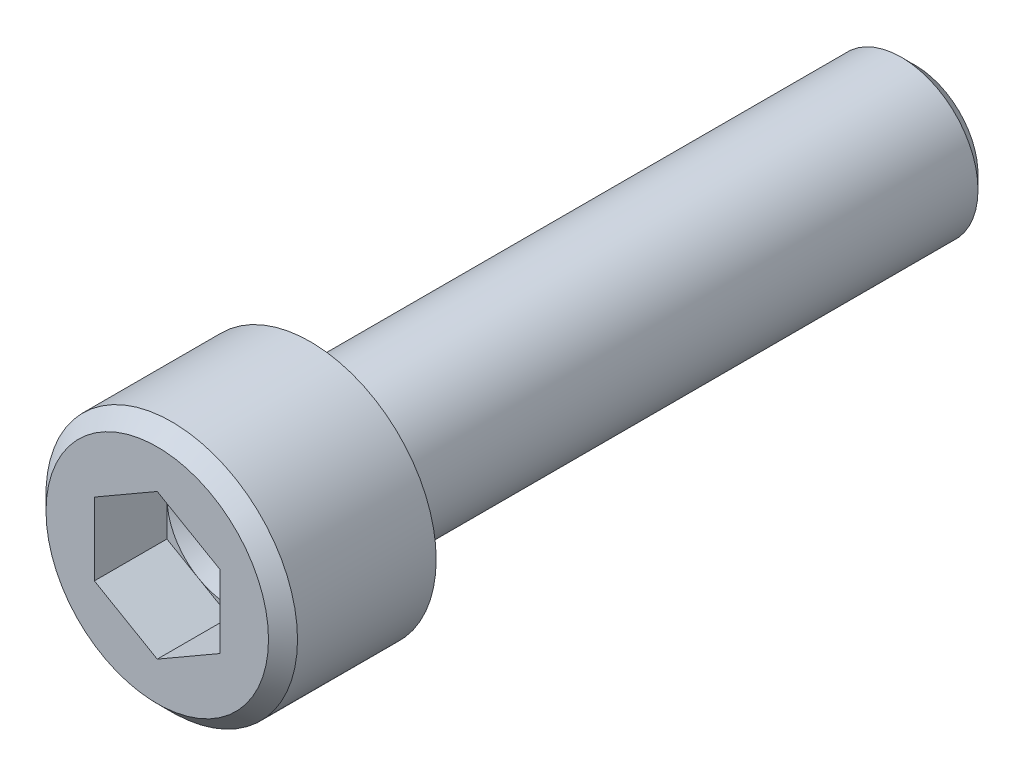
ISO-10303-21;
HEADER;
FILE_DESCRIPTION(('STEP AP214'),'2;1');
FILE_NAME('part.step','',(''),(''),'','','');
FILE_SCHEMA(('AUTOMOTIVE_DESIGN { 1 0 10303 214 1 1 1 1 }'));
ENDSEC;
DATA;
#1=APPLICATION_CONTEXT('core data for automotive mechanical design processes');
#2=APPLICATION_PROTOCOL_DEFINITION('international standard','automotive_design',2000,#1);
#3=PRODUCT_CONTEXT('',#1,'mechanical');
#4=PRODUCT('Part','Part','',(#3));
#5=PRODUCT_RELATED_PRODUCT_CATEGORY('part','',(#4));
#6=PRODUCT_DEFINITION_FORMATION('','',#4);
#7=PRODUCT_DEFINITION_CONTEXT('part definition',#1,'design');
#8=PRODUCT_DEFINITION('design','',#6,#7);
#9=PRODUCT_DEFINITION_SHAPE('','',#8);
#10=(LENGTH_UNIT() NAMED_UNIT(*) SI_UNIT(.MILLI.,.METRE.));
#11=(NAMED_UNIT(*) PLANE_ANGLE_UNIT() SI_UNIT($,.RADIAN.));
#12=(NAMED_UNIT(*) SI_UNIT($,.STERADIAN.) SOLID_ANGLE_UNIT());
#13=UNCERTAINTY_MEASURE_WITH_UNIT(LENGTH_MEASURE(1.E-05),#10,'distance_accuracy_value','');
#14=(GEOMETRIC_REPRESENTATION_CONTEXT(3) GLOBAL_UNCERTAINTY_ASSIGNED_CONTEXT((#13)) GLOBAL_UNIT_ASSIGNED_CONTEXT((#10,
#11,#12)) REPRESENTATION_CONTEXT('',''));
#15=CARTESIAN_POINT('',(0.,0.,0.));
#16=DIRECTION('',(0.,0.,1.));
#17=DIRECTION('',(1.,0.,0.));
#18=AXIS2_PLACEMENT_3D('',#15,#16,#17);
#19=CARTESIAN_POINT('',(0.,0.,2.54));
#20=DIRECTION('',(0.,0.,1.));
#21=DIRECTION('',(1.,0.,0.));
#22=AXIS2_PLACEMENT_3D('',#19,#20,#21);
#23=PLANE('',#22);
#24=DIRECTION('',(0.,1.,0.));
#25=VECTOR('',#24,1.);
#26=CARTESIAN_POINT('',(-1.9812,0.,2.54));
#27=LINE('',#26,#25);
#28=CARTESIAN_POINT('',(-1.9812,0.,2.54));
#29=VERTEX_POINT('',#28);
#30=CARTESIAN_POINT('',(-1.9812,1.14384635331848,2.54));
#31=VERTEX_POINT('',#30);
#32=EDGE_CURVE('E398',#29,#31,#27,.T.);
#33=ORIENTED_EDGE('',*,*,#32,.F.);
#34=CARTESIAN_POINT('',(0.,0.,2.54));
#35=DIRECTION('',(0.,0.,-1.));
#36=DIRECTION('',(-1.,0.,0.));
#37=AXIS2_PLACEMENT_3D('',#34,#35,#36);
#38=CIRCLE('',#37,1.9812);
#39=CARTESIAN_POINT('',(-0.9906,1.71576952997773,2.54));
#40=VERTEX_POINT('',#39);
#41=EDGE_CURVE('E33',#29,#40,#38,.T.);
#42=ORIENTED_EDGE('',*,*,#41,.T.);
#43=DIRECTION('',(0.866025403784439,0.5,0.));
#44=VECTOR('',#43,1.);
#45=CARTESIAN_POINT('',(0.163354175866616,2.38200528404682,2.54));
#46=LINE('',#45,#44);
#47=EDGE_CURVE('E393',#31,#40,#46,.T.);
#48=ORIENTED_EDGE('',*,*,#47,.F.);
#49=EDGE_LOOP('',(#33,#42,#48));
#50=FACE_BOUND('',#49,.T.);
#51=ADVANCED_FACE('F17',(#50),#23,.T.);
#52=CARTESIAN_POINT('',(0.,2.28769270663697,2.54));
#53=VERTEX_POINT('',#52);
#54=EDGE_CURVE('E391',#40,#53,#46,.T.);
#55=ORIENTED_EDGE('',*,*,#54,.F.);
#56=CARTESIAN_POINT('',(0.9906,1.71576952997773,2.54));
#57=VERTEX_POINT('',#56);
#58=EDGE_CURVE('E223',#40,#57,#38,.T.);
#59=ORIENTED_EDGE('',*,*,#58,.T.);
#60=DIRECTION('',(0.866025403784439,-0.5,0.));
#61=VECTOR('',#60,1.);
#62=CARTESIAN_POINT('',(-0.163354175866613,2.38200528404681,2.54));
#63=LINE('',#62,#61);
#64=EDGE_CURVE('E383',#53,#57,#63,.T.);
#65=ORIENTED_EDGE('',*,*,#64,.F.);
#66=EDGE_LOOP('',(#55,#59,#65));
#67=FACE_BOUND('',#66,.T.);
#68=ADVANCED_FACE('F105',(#67),#23,.T.);
#69=CARTESIAN_POINT('',(1.9812,1.14384635331849,2.54));
#70=VERTEX_POINT('',#69);
#71=EDGE_CURVE('E188',#57,#70,#63,.T.);
#72=ORIENTED_EDGE('',*,*,#71,.F.);
#73=CARTESIAN_POINT('',(1.9812,0.,2.54));
#74=VERTEX_POINT('',#73);
#75=EDGE_CURVE('E380',#57,#74,#38,.T.);
#76=ORIENTED_EDGE('',*,*,#75,.T.);
#77=DIRECTION('',(0.,-1.,0.));
#78=VECTOR('',#77,1.);
#79=CARTESIAN_POINT('',(1.9812,0.,2.54));
#80=LINE('',#79,#78);
#81=EDGE_CURVE('E158',#70,#74,#80,.T.);
#82=ORIENTED_EDGE('',*,*,#81,.F.);
#83=EDGE_LOOP('',(#72,#76,#82));
#84=FACE_BOUND('',#83,.T.);
#85=ADVANCED_FACE('F111',(#84),#23,.T.);
#86=CARTESIAN_POINT('',(1.9812,-1.14384635331849,2.54));
#87=VERTEX_POINT('',#86);
#88=EDGE_CURVE('E155',#74,#87,#80,.T.);
#89=ORIENTED_EDGE('',*,*,#88,.F.);
#90=CARTESIAN_POINT('',(0.9906,-1.71576952997773,2.54));
#91=VERTEX_POINT('',#90);
#92=EDGE_CURVE('E415',#74,#91,#38,.T.);
#93=ORIENTED_EDGE('',*,*,#92,.T.);
#94=DIRECTION('',(-0.866025403784438,-0.5,0.));
#95=VECTOR('',#94,1.);
#96=CARTESIAN_POINT('',(2.14455417586661,-1.04953377590865,2.54));
#97=LINE('',#96,#95);
#98=EDGE_CURVE('E148',#87,#91,#97,.T.);
#99=ORIENTED_EDGE('',*,*,#98,.F.);
#100=EDGE_LOOP('',(#89,#93,#99));
#101=FACE_BOUND('',#100,.T.);
#102=ADVANCED_FACE('F129',(#101),#23,.T.);
#103=CARTESIAN_POINT('',(0.,-2.28769270663697,2.54));
#104=VERTEX_POINT('',#103);
#105=EDGE_CURVE('E141',#91,#104,#97,.T.);
#106=ORIENTED_EDGE('',*,*,#105,.F.);
#107=CARTESIAN_POINT('',(-0.9906,-1.71576952997773,2.54));
#108=VERTEX_POINT('',#107);
#109=EDGE_CURVE('E143',#91,#108,#38,.T.);
#110=ORIENTED_EDGE('',*,*,#109,.T.);
#111=DIRECTION('',(-0.866025403784439,0.5,0.));
#112=VECTOR('',#111,1.);
#113=CARTESIAN_POINT('',(-2.14455417586661,-1.04953377590865,2.54));
#114=LINE('',#113,#112);
#115=EDGE_CURVE('E145',#104,#108,#114,.T.);
#116=ORIENTED_EDGE('',*,*,#115,.F.);
#117=EDGE_LOOP('',(#106,#110,#116));
#118=FACE_BOUND('',#117,.T.);
#119=ADVANCED_FACE('F119',(#118),#23,.T.);
#120=CARTESIAN_POINT('',(0.,0.,4.826));
#121=DIRECTION('',(0.,0.,1.));
#122=DIRECTION('',(1.,0.,0.));
#123=AXIS2_PLACEMENT_3D('',#120,#121,#122);
#124=PLANE('',#123);
#125=CARTESIAN_POINT('',(0.,0.,4.826));
#126=DIRECTION('',(0.,0.,1.));
#127=DIRECTION('',(1.,0.,0.));
#128=AXIS2_PLACEMENT_3D('',#125,#126,#127);
#129=CIRCLE('',#128,3.5052);
#130=CARTESIAN_POINT('',(3.5052,0.,4.826));
#131=VERTEX_POINT('',#130);
#132=EDGE_CURVE('E209',#131,#131,#129,.T.);
#133=ORIENTED_EDGE('',*,*,#132,.T.);
#134=EDGE_LOOP('',(#133));
#135=FACE_BOUND('',#134,.T.);
#136=DIRECTION('',(0.866025403784439,0.5,0.));
#137=VECTOR('',#136,1.);
#138=CARTESIAN_POINT('',(0.163354175866616,2.38200528404682,4.826));
#139=LINE('',#138,#137);
#140=CARTESIAN_POINT('',(-1.9812,1.14384635331848,4.826));
#141=VERTEX_POINT('',#140);
#142=CARTESIAN_POINT('',(0.,2.28769270663697,4.826));
#143=VERTEX_POINT('',#142);
#144=EDGE_CURVE('E170',#141,#143,#139,.T.);
#145=ORIENTED_EDGE('',*,*,#144,.T.);
#146=DIRECTION('',(0.866025403784439,-0.5,0.));
#147=VECTOR('',#146,1.);
#148=CARTESIAN_POINT('',(-0.163354175866613,2.38200528404681,4.826));
#149=LINE('',#148,#147);
#150=CARTESIAN_POINT('',(1.9812,1.14384635331849,4.826));
#151=VERTEX_POINT('',#150);
#152=EDGE_CURVE('E166',#143,#151,#149,.T.);
#153=ORIENTED_EDGE('',*,*,#152,.T.);
#154=DIRECTION('',(0.,-1.,0.));
#155=VECTOR('',#154,1.);
#156=CARTESIAN_POINT('',(1.9812,0.,4.826));
#157=LINE('',#156,#155);
#158=CARTESIAN_POINT('',(1.9812,-1.14384635331849,4.826));
#159=VERTEX_POINT('',#158);
#160=EDGE_CURVE('E184',#151,#159,#157,.T.);
#161=ORIENTED_EDGE('',*,*,#160,.T.);
#162=DIRECTION('',(-0.866025403784438,-0.5,0.));
#163=VECTOR('',#162,1.);
#164=CARTESIAN_POINT('',(2.14455417586661,-1.04953377590865,4.826));
#165=LINE('',#164,#163);
#166=CARTESIAN_POINT('',(0.,-2.28769270663697,4.826));
#167=VERTEX_POINT('',#166);
#168=EDGE_CURVE('E41',#159,#167,#165,.T.);
#169=ORIENTED_EDGE('',*,*,#168,.T.);
#170=DIRECTION('',(-0.866025403784439,0.5,0.));
#171=VECTOR('',#170,1.);
#172=CARTESIAN_POINT('',(-2.14455417586661,-1.04953377590865,4.826));
#173=LINE('',#172,#171);
#174=CARTESIAN_POINT('',(-1.9812,-1.14384635331849,4.826));
#175=VERTEX_POINT('',#174);
#176=EDGE_CURVE('E178',#167,#175,#173,.T.);
#177=ORIENTED_EDGE('',*,*,#176,.T.);
#178=DIRECTION('',(0.,1.,0.));
#179=VECTOR('',#178,1.);
#180=CARTESIAN_POINT('',(-1.9812,0.,4.826));
#181=LINE('',#180,#179);
#182=EDGE_CURVE('E174',#175,#141,#181,.T.);
#183=ORIENTED_EDGE('',*,*,#182,.T.);
#184=EDGE_LOOP('',(#145,#153,#161,#169,#177,#183));
#185=FACE_BOUND('',#184,.T.);
#186=ADVANCED_FACE('F128',(#135,#185),#124,.T.);
#187=CARTESIAN_POINT('',(0.,0.,4.826));
#188=DIRECTION('',(0.,0.,-1.));
#189=DIRECTION('',(-1.,0.,0.));
#190=AXIS2_PLACEMENT_3D('',#187,#188,#189);
#191=CYLINDRICAL_SURFACE('',#190,3.9624);
#192=CARTESIAN_POINT('',(0.,0.,4.3688));
#193=DIRECTION('',(0.,0.,1.));
#194=DIRECTION('',(1.,0.,0.));
#195=AXIS2_PLACEMENT_3D('',#192,#193,#194);
#196=CIRCLE('',#195,3.9624);
#197=CARTESIAN_POINT('',(3.9624,0.,4.3688));
#198=VERTEX_POINT('',#197);
#199=EDGE_CURVE('E213',#198,#198,#196,.F.);
#200=ORIENTED_EDGE('',*,*,#199,.T.);
#201=EDGE_LOOP('',(#200));
#202=FACE_BOUND('',#201,.T.);
#203=CARTESIAN_POINT('',(0.,0.,0.));
#204=DIRECTION('',(0.,0.,1.));
#205=DIRECTION('',(1.,0.,0.));
#206=AXIS2_PLACEMENT_3D('',#203,#204,#205);
#207=CIRCLE('',#206,3.9624);
#208=CARTESIAN_POINT('',(3.9624,0.,0.));
#209=VERTEX_POINT('',#208);
#210=EDGE_CURVE('E205',#209,#209,#207,.T.);
#211=ORIENTED_EDGE('',*,*,#210,.T.);
#212=EDGE_LOOP('',(#211));
#213=FACE_BOUND('',#212,.T.);
#214=ADVANCED_FACE('F134',(#202,#213),#191,.T.);
#215=CARTESIAN_POINT('',(0.,0.,0.));
#216=DIRECTION('',(0.,0.,1.));
#217=DIRECTION('',(1.,0.,0.));
#218=AXIS2_PLACEMENT_3D('',#215,#216,#217);
#219=PLANE('',#218);
#220=CARTESIAN_POINT('',(0.,0.,0.));
#221=DIRECTION('',(0.,0.,1.));
#222=DIRECTION('',(1.,0.,0.));
#223=AXIS2_PLACEMENT_3D('',#220,#221,#222);
#224=CIRCLE('',#223,2.5654);
#225=CARTESIAN_POINT('',(2.5654,0.,0.));
#226=VERTEX_POINT('',#225);
#227=EDGE_CURVE('E222',#226,#226,#224,.T.);
#228=ORIENTED_EDGE('',*,*,#227,.T.);
#229=EDGE_LOOP('',(#228));
#230=FACE_BOUND('',#229,.T.);
#231=ORIENTED_EDGE('',*,*,#210,.F.);
#232=EDGE_LOOP('',(#231));
#233=FACE_BOUND('',#232,.T.);
#234=ADVANCED_FACE('F324',(#230,#233),#219,.F.);
#235=CARTESIAN_POINT('',(0.,0.,4.826));
#236=DIRECTION('',(0.,0.,-1.));
#237=DIRECTION('',(-1.,0.,0.));
#238=AXIS2_PLACEMENT_3D('',#235,#236,#237);
#239=CONICAL_SURFACE('',#238,3.5052,0.785398163397449);
#240=ORIENTED_EDGE('',*,*,#199,.F.);
#241=EDGE_LOOP('',(#240));
#242=FACE_BOUND('',#241,.T.);
#243=ORIENTED_EDGE('',*,*,#132,.F.);
#244=EDGE_LOOP('',(#243));
#245=FACE_BOUND('',#244,.T.);
#246=ADVANCED_FACE('F315',(#242,#245),#239,.T.);
#247=CARTESIAN_POINT('',(-0.163354175866613,2.38200528404681,2.54));
#248=DIRECTION('',(-0.5,-0.866025403784439,0.));
#249=DIRECTION('',(0.866025403784439,-0.5,0.));
#250=AXIS2_PLACEMENT_3D('',#247,#248,#249);
#251=PLANE('',#250);
#252=ORIENTED_EDGE('',*,*,#152,.F.);
#253=DIRECTION('',(0.,0.,1.));
#254=VECTOR('',#253,1.);
#255=CARTESIAN_POINT('',(0.,2.28769270663697,2.54));
#256=LINE('',#255,#254);
#257=EDGE_CURVE('E202',#53,#143,#256,.T.);
#258=ORIENTED_EDGE('',*,*,#257,.F.);
#259=ORIENTED_EDGE('',*,*,#64,.T.);
#260=ORIENTED_EDGE('',*,*,#71,.T.);
#261=DIRECTION('',(0.,0.,1.));
#262=VECTOR('',#261,1.);
#263=CARTESIAN_POINT('',(1.9812,1.14384635331849,2.54));
#264=LINE('',#263,#262);
#265=EDGE_CURVE('E165',#70,#151,#264,.T.);
#266=ORIENTED_EDGE('',*,*,#265,.T.);
#267=EDGE_LOOP('',(#252,#258,#259,#260,#266));
#268=FACE_BOUND('',#267,.T.);
#269=ADVANCED_FACE('F306',(#268),#251,.T.);
#270=CARTESIAN_POINT('',(0.163354175866616,2.38200528404682,2.54));
#271=DIRECTION('',(0.5,-0.866025403784438,0.));
#272=DIRECTION('',(0.866025403784438,0.5,0.));
#273=AXIS2_PLACEMENT_3D('',#270,#271,#272);
#274=PLANE('',#273);
#275=ORIENTED_EDGE('',*,*,#144,.F.);
#276=DIRECTION('',(0.,0.,1.));
#277=VECTOR('',#276,1.);
#278=CARTESIAN_POINT('',(-1.9812,1.14384635331848,2.54));
#279=LINE('',#278,#277);
#280=EDGE_CURVE('E199',#31,#141,#279,.T.);
#281=ORIENTED_EDGE('',*,*,#280,.F.);
#282=ORIENTED_EDGE('',*,*,#47,.T.);
#283=ORIENTED_EDGE('',*,*,#54,.T.);
#284=ORIENTED_EDGE('',*,*,#257,.T.);
#285=EDGE_LOOP('',(#275,#281,#282,#283,#284));
#286=FACE_BOUND('',#285,.T.);
#287=ADVANCED_FACE('F297',(#286),#274,.T.);
#288=CARTESIAN_POINT('',(-1.9812,0.,2.54));
#289=DIRECTION('',(1.,0.,0.));
#290=DIRECTION('',(0.,1.,0.));
#291=AXIS2_PLACEMENT_3D('',#288,#289,#290);
#292=PLANE('',#291);
#293=ORIENTED_EDGE('',*,*,#182,.F.);
#294=DIRECTION('',(0.,0.,1.));
#295=VECTOR('',#294,1.);
#296=CARTESIAN_POINT('',(-1.9812,-1.14384635331849,2.54));
#297=LINE('',#296,#295);
#298=CARTESIAN_POINT('',(-1.9812,-1.14384635331849,2.54));
#299=VERTEX_POINT('',#298);
#300=EDGE_CURVE('E196',#299,#175,#297,.T.);
#301=ORIENTED_EDGE('',*,*,#300,.F.);
#302=EDGE_CURVE('E399',#299,#29,#27,.T.);
#303=ORIENTED_EDGE('',*,*,#302,.T.);
#304=ORIENTED_EDGE('',*,*,#32,.T.);
#305=ORIENTED_EDGE('',*,*,#280,.T.);
#306=EDGE_LOOP('',(#293,#301,#303,#304,#305));
#307=FACE_BOUND('',#306,.T.);
#308=ADVANCED_FACE('F288',(#307),#292,.T.);
#309=CARTESIAN_POINT('',(-2.14455417586661,-1.04953377590865,2.54));
#310=DIRECTION('',(0.5,0.866025403784439,0.));
#311=DIRECTION('',(-0.866025403784439,0.5,0.));
#312=AXIS2_PLACEMENT_3D('',#309,#310,#311);
#313=PLANE('',#312);
#314=ORIENTED_EDGE('',*,*,#176,.F.);
#315=DIRECTION('',(0.,0.,1.));
#316=VECTOR('',#315,1.);
#317=CARTESIAN_POINT('',(0.,-2.28769270663697,2.54));
#318=LINE('',#317,#316);
#319=EDGE_CURVE('E193',#104,#167,#318,.T.);
#320=ORIENTED_EDGE('',*,*,#319,.F.);
#321=ORIENTED_EDGE('',*,*,#115,.T.);
#322=EDGE_CURVE('E401',#108,#299,#114,.T.);
#323=ORIENTED_EDGE('',*,*,#322,.T.);
#324=ORIENTED_EDGE('',*,*,#300,.T.);
#325=EDGE_LOOP('',(#314,#320,#321,#323,#324));
#326=FACE_BOUND('',#325,.T.);
#327=ADVANCED_FACE('F280',(#326),#313,.T.);
#328=CARTESIAN_POINT('',(2.14455417586661,-1.04953377590865,2.54));
#329=DIRECTION('',(-0.5,0.866025403784438,0.));
#330=DIRECTION('',(-0.866025403784438,-0.5,0.));
#331=AXIS2_PLACEMENT_3D('',#328,#329,#330);
#332=PLANE('',#331);
#333=ORIENTED_EDGE('',*,*,#168,.F.);
#334=DIRECTION('',(0.,0.,1.));
#335=VECTOR('',#334,1.);
#336=CARTESIAN_POINT('',(1.9812,-1.14384635331849,2.54));
#337=LINE('',#336,#335);
#338=EDGE_CURVE('E151',#87,#159,#337,.T.);
#339=ORIENTED_EDGE('',*,*,#338,.F.);
#340=ORIENTED_EDGE('',*,*,#98,.T.);
#341=ORIENTED_EDGE('',*,*,#105,.T.);
#342=ORIENTED_EDGE('',*,*,#319,.T.);
#343=EDGE_LOOP('',(#333,#339,#340,#341,#342));
#344=FACE_BOUND('',#343,.T.);
#345=ADVANCED_FACE('F124',(#344),#332,.T.);
#346=CARTESIAN_POINT('',(1.9812,0.,2.54));
#347=DIRECTION('',(-1.,0.,0.));
#348=DIRECTION('',(0.,-1.,0.));
#349=AXIS2_PLACEMENT_3D('',#346,#347,#348);
#350=PLANE('',#349);
#351=ORIENTED_EDGE('',*,*,#160,.F.);
#352=ORIENTED_EDGE('',*,*,#265,.F.);
#353=ORIENTED_EDGE('',*,*,#81,.T.);
#354=ORIENTED_EDGE('',*,*,#88,.T.);
#355=ORIENTED_EDGE('',*,*,#338,.T.);
#356=EDGE_LOOP('',(#351,#352,#353,#354,#355));
#357=FACE_BOUND('',#356,.T.);
#358=ADVANCED_FACE('F117',(#357),#350,.T.);
#359=ORIENTED_EDGE('',*,*,#322,.F.);
#360=EDGE_CURVE('E217',#108,#29,#38,.T.);
#361=ORIENTED_EDGE('',*,*,#360,.T.);
#362=ORIENTED_EDGE('',*,*,#302,.F.);
#363=EDGE_LOOP('',(#359,#361,#362));
#364=FACE_BOUND('',#363,.T.);
#365=ADVANCED_FACE('F108',(#364),#23,.T.);
#366=CARTESIAN_POINT('',(0.,0.,-19.05));
#367=DIRECTION('',(0.,0.,1.));
#368=DIRECTION('',(1.,0.,0.));
#369=AXIS2_PLACEMENT_3D('',#366,#367,#368);
#370=CYLINDRICAL_SURFACE('',#369,2.413);
#371=CARTESIAN_POINT('',(0.,0.,-18.62105761938));
#372=DIRECTION('',(0.,0.,-1.));
#373=DIRECTION('',(-1.,0.,0.));
#374=AXIS2_PLACEMENT_3D('',#371,#372,#373);
#375=CIRCLE('',#374,2.413);
#376=CARTESIAN_POINT('',(-2.413,0.,-18.62105761938));
#377=VERTEX_POINT('',#376);
#378=EDGE_CURVE('E11',#377,#377,#375,.F.);
#379=ORIENTED_EDGE('',*,*,#378,.T.);
#380=EDGE_LOOP('',(#379));
#381=FACE_BOUND('',#380,.T.);
#382=CARTESIAN_POINT('',(0.,0.,-0.1524));
#383=DIRECTION('',(0.,0.,1.));
#384=DIRECTION('',(1.,0.,0.));
#385=AXIS2_PLACEMENT_3D('',#382,#383,#384);
#386=CIRCLE('',#385,2.413);
#387=CARTESIAN_POINT('',(2.413,0.,-0.1524));
#388=VERTEX_POINT('',#387);
#389=EDGE_CURVE('E218',#388,#388,#386,.F.);
#390=ORIENTED_EDGE('',*,*,#389,.T.);
#391=EDGE_LOOP('',(#390));
#392=FACE_BOUND('',#391,.T.);
#393=ADVANCED_FACE('F101',(#381,#392),#370,.T.);
#394=CARTESIAN_POINT('',(0.,0.,-19.05));
#395=DIRECTION('',(0.,0.,-1.));
#396=DIRECTION('',(1.,0.,0.));
#397=AXIS2_PLACEMENT_3D('',#394,#395,#396);
#398=PLANE('',#397);
#399=CARTESIAN_POINT('',(0.,0.,-19.05));
#400=DIRECTION('',(0.,0.,-1.));
#401=DIRECTION('',(-1.,0.,0.));
#402=AXIS2_PLACEMENT_3D('',#399,#400,#401);
#403=CIRCLE('',#402,1.98405761938);
#404=CARTESIAN_POINT('',(-1.98405761938,0.,-19.05));
#405=VERTEX_POINT('',#404);
#406=EDGE_CURVE('E26',#405,#405,#403,.T.);
#407=ORIENTED_EDGE('',*,*,#406,.T.);
#408=EDGE_LOOP('',(#407));
#409=FACE_BOUND('',#408,.T.);
#410=ADVANCED_FACE('F94',(#409),#398,.T.);
#411=CARTESIAN_POINT('',(0.,0.,1.39615364668151));
#412=DIRECTION('',(0.,0.,1.));
#413=DIRECTION('',(1.,0.,0.));
#414=AXIS2_PLACEMENT_3D('',#411,#412,#413);
#415=CONICAL_SURFACE('',#414,0.,1.0471975511966);
#416=ORIENTED_EDGE('',*,*,#41,.F.);
#417=ORIENTED_EDGE('',*,*,#360,.F.);
#418=ORIENTED_EDGE('',*,*,#109,.F.);
#419=ORIENTED_EDGE('',*,*,#92,.F.);
#420=ORIENTED_EDGE('',*,*,#75,.F.);
#421=ORIENTED_EDGE('',*,*,#58,.F.);
#422=EDGE_LOOP('',(#416,#417,#418,#419,#420,#421));
#423=FACE_BOUND('',#422,.T.);
#424=CARTESIAN_POINT('',(0.,0.,1.39615364668151));
#425=VERTEX_POINT('',#424);
#426=VERTEX_LOOP('',#425);
#427=FACE_BOUND('',#426,.T.);
#428=ADVANCED_FACE('F91',(#423,#427),#415,.F.);
#429=CARTESIAN_POINT('',(0.,0.,-0.1524));
#430=DIRECTION('',(0.,0.,1.));
#431=DIRECTION('',(1.,0.,0.));
#432=AXIS2_PLACEMENT_3D('',#429,#430,#431);
#433=TOROIDAL_SURFACE('',#432,2.5654,0.1524);
#434=ORIENTED_EDGE('',*,*,#227,.F.);
#435=EDGE_LOOP('',(#434));
#436=FACE_BOUND('',#435,.T.);
#437=ORIENTED_EDGE('',*,*,#389,.F.);
#438=EDGE_LOOP('',(#437));
#439=FACE_BOUND('',#438,.T.);
#440=ADVANCED_FACE('F93',(#436,#439),#433,.F.);
#441=CARTESIAN_POINT('',(0.,0.,-19.05));
#442=DIRECTION('',(0.,0.,1.));
#443=DIRECTION('',(1.,0.,0.));
#444=AXIS2_PLACEMENT_3D('',#441,#442,#443);
#445=CONICAL_SURFACE('',#444,1.98405761938,0.785398163397449);
#446=ORIENTED_EDGE('',*,*,#378,.F.);
#447=EDGE_LOOP('',(#446));
#448=FACE_BOUND('',#447,.T.);
#449=ORIENTED_EDGE('',*,*,#406,.F.);
#450=EDGE_LOOP('',(#449));
#451=FACE_BOUND('',#450,.T.);
#452=ADVANCED_FACE('F19',(#448,#451),#445,.T.);
#453=CLOSED_SHELL('',(#51,#68,#85,#102,#119,#186,#214,#234,#246,#269,#287,#308,#327,#345,#358,
#365,#393,#410,#428,#440,#452));
#454=MANIFOLD_SOLID_BREP('B1',#453);
#455=ADVANCED_BREP_SHAPE_REPRESENTATION('',(#18,#454),#14);
#456=SHAPE_DEFINITION_REPRESENTATION(#9,#455);
ENDSEC;
END-ISO-10303-21;
